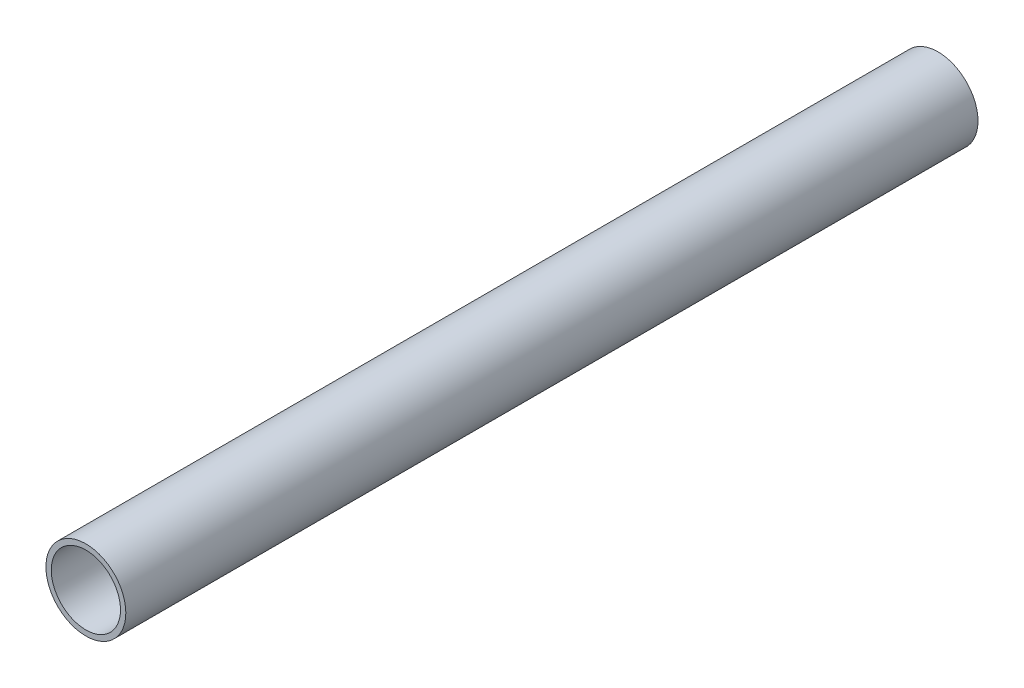
ISO-10303-21;
HEADER;
FILE_DESCRIPTION(('STEP AP214'),'2;1');
FILE_NAME('part.step','',(''),(''),'','','');
FILE_SCHEMA(('AUTOMOTIVE_DESIGN { 1 0 10303 214 1 1 1 1 }'));
ENDSEC;
DATA;
#1=APPLICATION_CONTEXT('core data for automotive mechanical design processes');
#2=APPLICATION_PROTOCOL_DEFINITION('international standard','automotive_design',2000,#1);
#3=PRODUCT_CONTEXT('',#1,'mechanical');
#4=PRODUCT('Part','Part','',(#3));
#5=PRODUCT_RELATED_PRODUCT_CATEGORY('part','',(#4));
#6=PRODUCT_DEFINITION_FORMATION('','',#4);
#7=PRODUCT_DEFINITION_CONTEXT('part definition',#1,'design');
#8=PRODUCT_DEFINITION('design','',#6,#7);
#9=PRODUCT_DEFINITION_SHAPE('','',#8);
#10=(LENGTH_UNIT() NAMED_UNIT(*) SI_UNIT(.MILLI.,.METRE.));
#11=(NAMED_UNIT(*) PLANE_ANGLE_UNIT() SI_UNIT($,.RADIAN.));
#12=(NAMED_UNIT(*) SI_UNIT($,.STERADIAN.) SOLID_ANGLE_UNIT());
#13=UNCERTAINTY_MEASURE_WITH_UNIT(LENGTH_MEASURE(1.E-05),#10,'distance_accuracy_value','');
#14=(GEOMETRIC_REPRESENTATION_CONTEXT(3) GLOBAL_UNCERTAINTY_ASSIGNED_CONTEXT((#13)) GLOBAL_UNIT_ASSIGNED_CONTEXT((#10,
#11,#12)) REPRESENTATION_CONTEXT('',''));
#15=CARTESIAN_POINT('',(0.,0.,0.));
#16=DIRECTION('',(0.,0.,1.));
#17=DIRECTION('',(1.,0.,0.));
#18=AXIS2_PLACEMENT_3D('',#15,#16,#17);
#19=CARTESIAN_POINT('',(0.,0.,160.));
#20=DIRECTION('',(0.,0.,1.));
#21=DIRECTION('',(1.,0.,0.));
#22=AXIS2_PLACEMENT_3D('',#19,#20,#21);
#23=PLANE('',#22);
#24=CARTESIAN_POINT('',(0.,0.,160.));
#25=DIRECTION('',(0.,0.,1.));
#26=DIRECTION('',(1.,0.,0.));
#27=AXIS2_PLACEMENT_3D('',#24,#25,#26);
#28=CIRCLE('',#27,7.5);
#29=CARTESIAN_POINT('',(7.5,0.,160.));
#30=VERTEX_POINT('',#29);
#31=EDGE_CURVE('E10',#30,#30,#28,.T.);
#32=ORIENTED_EDGE('',*,*,#31,.T.);
#33=EDGE_LOOP('',(#32));
#34=FACE_BOUND('',#33,.T.);
#35=CARTESIAN_POINT('',(0.,0.,160.));
#36=DIRECTION('',(0.,0.,1.));
#37=DIRECTION('',(1.,0.,0.));
#38=AXIS2_PLACEMENT_3D('',#35,#36,#37);
#39=CIRCLE('',#38,6.5);
#40=CARTESIAN_POINT('',(6.5,0.,160.));
#41=VERTEX_POINT('',#40);
#42=EDGE_CURVE('E57',#41,#41,#39,.T.);
#43=ORIENTED_EDGE('',*,*,#42,.F.);
#44=EDGE_LOOP('',(#43));
#45=FACE_BOUND('',#44,.T.);
#46=ADVANCED_FACE('F44',(#34,#45),#23,.T.);
#47=CARTESIAN_POINT('',(0.,0.,0.));
#48=DIRECTION('',(0.,0.,1.));
#49=DIRECTION('',(1.,0.,0.));
#50=AXIS2_PLACEMENT_3D('',#47,#48,#49);
#51=PLANE('',#50);
#52=CARTESIAN_POINT('',(0.,0.,0.));
#53=DIRECTION('',(0.,0.,1.));
#54=DIRECTION('',(1.,0.,0.));
#55=AXIS2_PLACEMENT_3D('',#52,#53,#54);
#56=CIRCLE('',#55,7.5);
#57=CARTESIAN_POINT('',(7.5,0.,0.));
#58=VERTEX_POINT('',#57);
#59=EDGE_CURVE('E47',#58,#58,#56,.T.);
#60=ORIENTED_EDGE('',*,*,#59,.F.);
#61=EDGE_LOOP('',(#60));
#62=FACE_BOUND('',#61,.T.);
#63=CARTESIAN_POINT('',(0.,0.,0.));
#64=DIRECTION('',(0.,0.,1.));
#65=DIRECTION('',(1.,0.,0.));
#66=AXIS2_PLACEMENT_3D('',#63,#64,#65);
#67=CIRCLE('',#66,6.5);
#68=CARTESIAN_POINT('',(6.5,0.,0.));
#69=VERTEX_POINT('',#68);
#70=EDGE_CURVE('E59',#69,#69,#67,.T.);
#71=ORIENTED_EDGE('',*,*,#70,.T.);
#72=EDGE_LOOP('',(#71));
#73=FACE_BOUND('',#72,.T.);
#74=ADVANCED_FACE('F66',(#62,#73),#51,.F.);
#75=CARTESIAN_POINT('',(0.,0.,160.));
#76=DIRECTION('',(0.,0.,-1.));
#77=DIRECTION('',(-1.,0.,0.));
#78=AXIS2_PLACEMENT_3D('',#75,#76,#77);
#79=CYLINDRICAL_SURFACE('',#78,7.5);
#80=ORIENTED_EDGE('',*,*,#31,.F.);
#81=EDGE_LOOP('',(#80));
#82=FACE_BOUND('',#81,.T.);
#83=ORIENTED_EDGE('',*,*,#59,.T.);
#84=EDGE_LOOP('',(#83));
#85=FACE_BOUND('',#84,.T.);
#86=ADVANCED_FACE('F50',(#82,#85),#79,.T.);
#87=CARTESIAN_POINT('',(0.,0.,160.));
#88=DIRECTION('',(0.,0.,-1.));
#89=DIRECTION('',(-1.,0.,0.));
#90=AXIS2_PLACEMENT_3D('',#87,#88,#89);
#91=CYLINDRICAL_SURFACE('',#90,6.5);
#92=ORIENTED_EDGE('',*,*,#42,.T.);
#93=EDGE_LOOP('',(#92));
#94=FACE_BOUND('',#93,.T.);
#95=ORIENTED_EDGE('',*,*,#70,.F.);
#96=EDGE_LOOP('',(#95));
#97=FACE_BOUND('',#96,.T.);
#98=ADVANCED_FACE('F64',(#94,#97),#91,.F.);
#99=CLOSED_SHELL('',(#46,#74,#86,#98));
#100=MANIFOLD_SOLID_BREP('B2',#99);
#101=ADVANCED_BREP_SHAPE_REPRESENTATION('',(#18,#100),#14);
#102=SHAPE_DEFINITION_REPRESENTATION(#9,#101);
ENDSEC;
END-ISO-10303-21;
